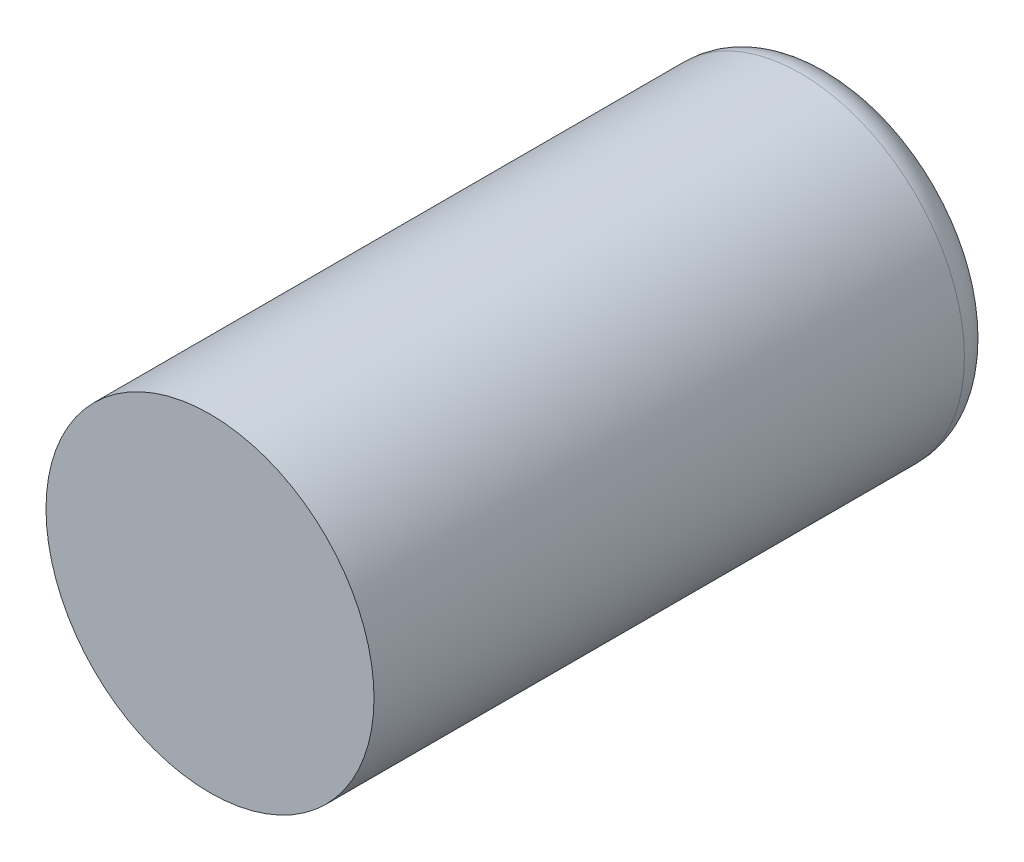
ISO-10303-21;
HEADER;
FILE_DESCRIPTION(('STEP AP214'),'2;1');
FILE_NAME('part.step','',(''),(''),'','','');
FILE_SCHEMA(('AUTOMOTIVE_DESIGN { 1 0 10303 214 1 1 1 1 }'));
ENDSEC;
DATA;
#1=APPLICATION_CONTEXT('core data for automotive mechanical design processes');
#2=APPLICATION_PROTOCOL_DEFINITION('international standard','automotive_design',2000,#1);
#3=PRODUCT_CONTEXT('',#1,'mechanical');
#4=PRODUCT('Part','Part','',(#3));
#5=PRODUCT_RELATED_PRODUCT_CATEGORY('part','',(#4));
#6=PRODUCT_DEFINITION_FORMATION('','',#4);
#7=PRODUCT_DEFINITION_CONTEXT('part definition',#1,'design');
#8=PRODUCT_DEFINITION('design','',#6,#7);
#9=PRODUCT_DEFINITION_SHAPE('','',#8);
#10=(LENGTH_UNIT() NAMED_UNIT(*) SI_UNIT(.MILLI.,.METRE.));
#11=(NAMED_UNIT(*) PLANE_ANGLE_UNIT() SI_UNIT($,.RADIAN.));
#12=(NAMED_UNIT(*) SI_UNIT($,.STERADIAN.) SOLID_ANGLE_UNIT());
#13=UNCERTAINTY_MEASURE_WITH_UNIT(LENGTH_MEASURE(1.E-05),#10,'distance_accuracy_value','');
#14=(GEOMETRIC_REPRESENTATION_CONTEXT(3) GLOBAL_UNCERTAINTY_ASSIGNED_CONTEXT((#13)) GLOBAL_UNIT_ASSIGNED_CONTEXT((#10,
#11,#12)) REPRESENTATION_CONTEXT('',''));
#15=CARTESIAN_POINT('',(0.,0.,0.));
#16=DIRECTION('',(0.,0.,1.));
#17=DIRECTION('',(1.,0.,0.));
#18=AXIS2_PLACEMENT_3D('',#15,#16,#17);
#19=CARTESIAN_POINT('',(0.,0.,19.));
#20=DIRECTION('',(0.,0.,-1.));
#21=DIRECTION('',(-1.,0.,0.));
#22=AXIS2_PLACEMENT_3D('',#19,#20,#21);
#23=CYLINDRICAL_SURFACE('',#22,5.);
#24=CARTESIAN_POINT('',(0.,0.,1.));
#25=DIRECTION('',(0.,0.,1.));
#26=DIRECTION('',(1.,0.,0.));
#27=AXIS2_PLACEMENT_3D('',#24,#25,#26);
#28=CIRCLE('',#27,5.);
#29=CARTESIAN_POINT('',(5.,0.,1.));
#30=VERTEX_POINT('',#29);
#31=EDGE_CURVE('E49',#30,#30,#28,.T.);
#32=ORIENTED_EDGE('',*,*,#31,.T.);
#33=EDGE_LOOP('',(#32));
#34=FACE_BOUND('',#33,.T.);
#35=CARTESIAN_POINT('',(0.,0.,19.));
#36=DIRECTION('',(0.,0.,1.));
#37=DIRECTION('',(1.,0.,0.));
#38=AXIS2_PLACEMENT_3D('',#35,#36,#37);
#39=CIRCLE('',#38,5.);
#40=CARTESIAN_POINT('',(5.,0.,19.));
#41=VERTEX_POINT('',#40);
#42=EDGE_CURVE('E54',#41,#41,#39,.T.);
#43=ORIENTED_EDGE('',*,*,#42,.F.);
#44=EDGE_LOOP('',(#43));
#45=FACE_BOUND('',#44,.T.);
#46=ADVANCED_FACE('F41',(#34,#45),#23,.T.);
#47=CARTESIAN_POINT('',(0.,0.,19.));
#48=DIRECTION('',(0.,0.,1.));
#49=DIRECTION('',(1.,0.,0.));
#50=AXIS2_PLACEMENT_3D('',#47,#48,#49);
#51=PLANE('',#50);
#52=ORIENTED_EDGE('',*,*,#42,.T.);
#53=EDGE_LOOP('',(#52));
#54=FACE_BOUND('',#53,.T.);
#55=ADVANCED_FACE('F62',(#54),#51,.T.);
#56=CARTESIAN_POINT('',(0.,0.,0.));
#57=DIRECTION('',(0.,0.,1.));
#58=DIRECTION('',(1.,0.,0.));
#59=AXIS2_PLACEMENT_3D('',#56,#57,#58);
#60=PLANE('',#59);
#61=CARTESIAN_POINT('',(0.,0.,0.));
#62=DIRECTION('',(0.,0.,1.));
#63=DIRECTION('',(1.,0.,0.));
#64=AXIS2_PLACEMENT_3D('',#61,#62,#63);
#65=CIRCLE('',#64,4.);
#66=CARTESIAN_POINT('',(4.,0.,0.));
#67=VERTEX_POINT('',#66);
#68=EDGE_CURVE('E10',#67,#67,#65,.F.);
#69=ORIENTED_EDGE('',*,*,#68,.T.);
#70=EDGE_LOOP('',(#69));
#71=FACE_BOUND('',#70,.T.);
#72=ADVANCED_FACE('F68',(#71),#60,.F.);
#73=CARTESIAN_POINT('',(0.,0.,1.));
#74=DIRECTION('',(0.,0.,1.));
#75=DIRECTION('',(1.,0.,0.));
#76=AXIS2_PLACEMENT_3D('',#73,#74,#75);
#77=TOROIDAL_SURFACE('',#76,4.,1.);
#78=ORIENTED_EDGE('',*,*,#68,.F.);
#79=EDGE_LOOP('',(#78));
#80=FACE_BOUND('',#79,.T.);
#81=ORIENTED_EDGE('',*,*,#31,.F.);
#82=EDGE_LOOP('',(#81));
#83=FACE_BOUND('',#82,.T.);
#84=ADVANCED_FACE('F43',(#80,#83),#77,.T.);
#85=CLOSED_SHELL('',(#46,#55,#72,#84));
#86=MANIFOLD_SOLID_BREP('B2',#85);
#87=ADVANCED_BREP_SHAPE_REPRESENTATION('',(#18,#86),#14);
#88=SHAPE_DEFINITION_REPRESENTATION(#9,#87);
ENDSEC;
END-ISO-10303-21;
